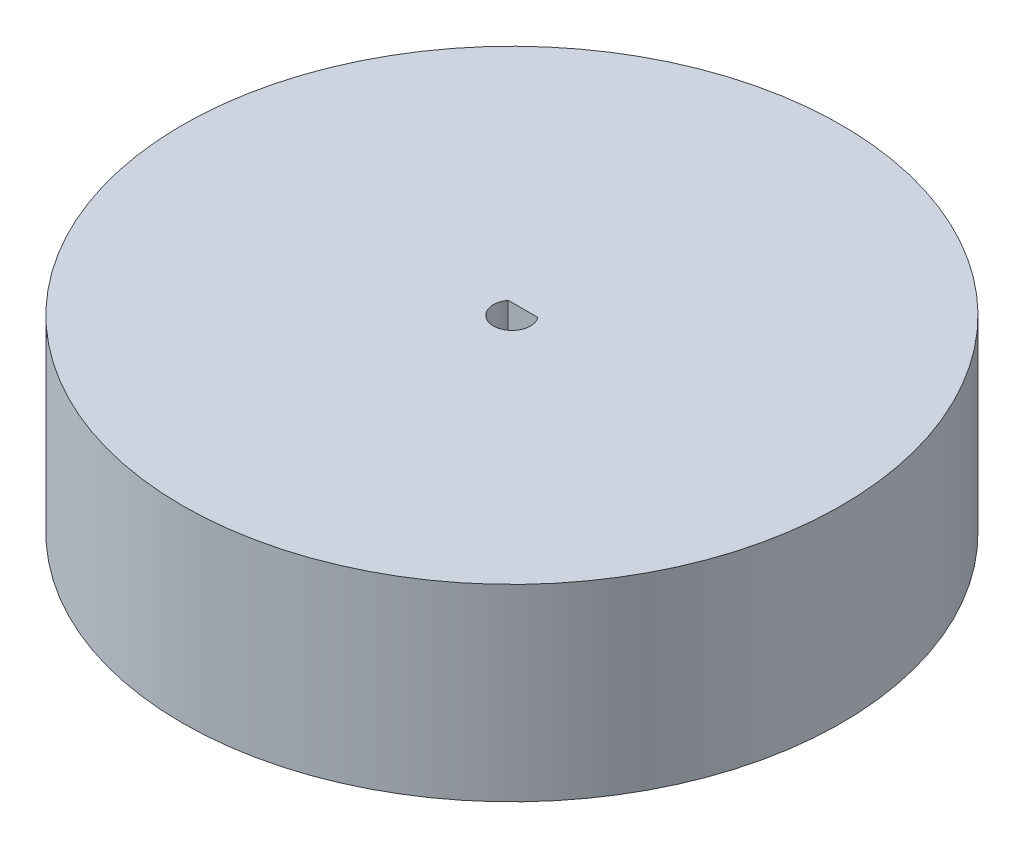
ISO-10303-21;
HEADER;
FILE_DESCRIPTION(('STEP AP214'),'2;1');
FILE_NAME('part.step','',(''),(''),'','','');
FILE_SCHEMA(('AUTOMOTIVE_DESIGN { 1 0 10303 214 1 1 1 1 }'));
ENDSEC;
DATA;
#1=APPLICATION_CONTEXT('core data for automotive mechanical design processes');
#2=APPLICATION_PROTOCOL_DEFINITION('international standard','automotive_design',2000,#1);
#3=PRODUCT_CONTEXT('',#1,'mechanical');
#4=PRODUCT('Part','Part','',(#3));
#5=PRODUCT_RELATED_PRODUCT_CATEGORY('part','',(#4));
#6=PRODUCT_DEFINITION_FORMATION('','',#4);
#7=PRODUCT_DEFINITION_CONTEXT('part definition',#1,'design');
#8=PRODUCT_DEFINITION('design','',#6,#7);
#9=PRODUCT_DEFINITION_SHAPE('','',#8);
#10=(LENGTH_UNIT() NAMED_UNIT(*) SI_UNIT(.MILLI.,.METRE.));
#11=(NAMED_UNIT(*) PLANE_ANGLE_UNIT() SI_UNIT($,.RADIAN.));
#12=(NAMED_UNIT(*) SI_UNIT($,.STERADIAN.) SOLID_ANGLE_UNIT());
#13=UNCERTAINTY_MEASURE_WITH_UNIT(LENGTH_MEASURE(1.E-05),#10,'distance_accuracy_value','');
#14=(GEOMETRIC_REPRESENTATION_CONTEXT(3) GLOBAL_UNCERTAINTY_ASSIGNED_CONTEXT((#13)) GLOBAL_UNIT_ASSIGNED_CONTEXT((#10,
#11,#12)) REPRESENTATION_CONTEXT('',''));
#15=CARTESIAN_POINT('',(0.,0.,0.));
#16=DIRECTION('',(0.,0.,1.));
#17=DIRECTION('',(1.,0.,0.));
#18=AXIS2_PLACEMENT_3D('',#15,#16,#17);
#19=CARTESIAN_POINT('',(0.,12.7,0.));
#20=DIRECTION('',(0.,-1.,0.));
#21=DIRECTION('',(0.,0.,-1.));
#22=AXIS2_PLACEMENT_3D('',#19,#20,#21);
#23=CYLINDRICAL_SURFACE('',#22,1.25);
#24=CARTESIAN_POINT('',(0.,0.,0.));
#25=DIRECTION('',(0.,1.,0.));
#26=DIRECTION('',(0.,0.,1.));
#27=AXIS2_PLACEMENT_3D('',#24,#25,#26);
#28=CIRCLE('',#27,1.25);
#29=CARTESIAN_POINT('',(-1.,0.,-0.75));
#30=VERTEX_POINT('',#29);
#31=CARTESIAN_POINT('',(1.,0.,-0.75));
#32=VERTEX_POINT('',#31);
#33=EDGE_CURVE('E67',#30,#32,#28,.T.);
#34=ORIENTED_EDGE('',*,*,#33,.F.);
#35=DIRECTION('',(0.,-1.,0.));
#36=VECTOR('',#35,1.);
#37=CARTESIAN_POINT('',(-1.,12.7,-0.75));
#38=LINE('',#37,#36);
#39=CARTESIAN_POINT('',(-1.,12.7,-0.75));
#40=VERTEX_POINT('',#39);
#41=EDGE_CURVE('E11',#40,#30,#38,.T.);
#42=ORIENTED_EDGE('',*,*,#41,.F.);
#43=CARTESIAN_POINT('',(0.,12.7,0.));
#44=DIRECTION('',(0.,1.,0.));
#45=DIRECTION('',(0.,0.,1.));
#46=AXIS2_PLACEMENT_3D('',#43,#44,#45);
#47=CIRCLE('',#46,1.25);
#48=CARTESIAN_POINT('',(1.,12.7,-0.75));
#49=VERTEX_POINT('',#48);
#50=EDGE_CURVE('E68',#40,#49,#47,.T.);
#51=ORIENTED_EDGE('',*,*,#50,.T.);
#52=DIRECTION('',(0.,-1.,0.));
#53=VECTOR('',#52,1.);
#54=CARTESIAN_POINT('',(1.,12.7,-0.75));
#55=LINE('',#54,#53);
#56=EDGE_CURVE('E47',#49,#32,#55,.T.);
#57=ORIENTED_EDGE('',*,*,#56,.T.);
#58=EDGE_LOOP('',(#34,#42,#51,#57));
#59=FACE_BOUND('',#58,.T.);
#60=ADVANCED_FACE('F39',(#59),#23,.F.);
#61=CARTESIAN_POINT('',(0.,12.7,-0.75));
#62=DIRECTION('',(0.,0.,-1.));
#63=DIRECTION('',(-1.,0.,0.));
#64=AXIS2_PLACEMENT_3D('',#61,#62,#63);
#65=PLANE('',#64);
#66=DIRECTION('',(1.,0.,0.));
#67=VECTOR('',#66,1.);
#68=CARTESIAN_POINT('',(0.,0.,-0.75));
#69=LINE('',#68,#67);
#70=EDGE_CURVE('E70',#30,#32,#69,.T.);
#71=ORIENTED_EDGE('',*,*,#70,.T.);
#72=ORIENTED_EDGE('',*,*,#56,.F.);
#73=DIRECTION('',(1.,0.,0.));
#74=VECTOR('',#73,1.);
#75=CARTESIAN_POINT('',(0.,12.7,-0.75));
#76=LINE('',#75,#74);
#77=EDGE_CURVE('E54',#40,#49,#76,.T.);
#78=ORIENTED_EDGE('',*,*,#77,.F.);
#79=ORIENTED_EDGE('',*,*,#41,.T.);
#80=EDGE_LOOP('',(#71,#72,#78,#79));
#81=FACE_BOUND('',#80,.T.);
#82=ADVANCED_FACE('F71',(#81),#65,.F.);
#83=CARTESIAN_POINT('',(0.,12.7,0.));
#84=DIRECTION('',(0.,-1.,0.));
#85=DIRECTION('',(0.,0.,-1.));
#86=AXIS2_PLACEMENT_3D('',#83,#84,#85);
#87=CYLINDRICAL_SURFACE('',#86,22.225);
#88=CARTESIAN_POINT('',(0.,12.7,0.));
#89=DIRECTION('',(0.,1.,0.));
#90=DIRECTION('',(0.,0.,1.));
#91=AXIS2_PLACEMENT_3D('',#88,#89,#90);
#92=CIRCLE('',#91,22.225);
#93=CARTESIAN_POINT('',(0.,12.7,22.225));
#94=VERTEX_POINT('',#93);
#95=EDGE_CURVE('E69',#94,#94,#92,.T.);
#96=ORIENTED_EDGE('',*,*,#95,.F.);
#97=EDGE_LOOP('',(#96));
#98=FACE_BOUND('',#97,.T.);
#99=CARTESIAN_POINT('',(0.,0.,0.));
#100=DIRECTION('',(0.,1.,0.));
#101=DIRECTION('',(0.,0.,1.));
#102=AXIS2_PLACEMENT_3D('',#99,#100,#101);
#103=CIRCLE('',#102,22.225);
#104=CARTESIAN_POINT('',(0.,0.,22.225));
#105=VERTEX_POINT('',#104);
#106=EDGE_CURVE('E73',#105,#105,#103,.T.);
#107=ORIENTED_EDGE('',*,*,#106,.T.);
#108=EDGE_LOOP('',(#107));
#109=FACE_BOUND('',#108,.T.);
#110=ADVANCED_FACE('F90',(#98,#109),#87,.T.);
#111=CARTESIAN_POINT('',(0.,12.7,0.));
#112=DIRECTION('',(0.,1.,0.));
#113=DIRECTION('',(0.,0.,1.));
#114=AXIS2_PLACEMENT_3D('',#111,#112,#113);
#115=PLANE('',#114);
#116=ORIENTED_EDGE('',*,*,#50,.F.);
#117=ORIENTED_EDGE('',*,*,#77,.T.);
#118=EDGE_LOOP('',(#116,#117));
#119=FACE_BOUND('',#118,.T.);
#120=ORIENTED_EDGE('',*,*,#95,.T.);
#121=EDGE_LOOP('',(#120));
#122=FACE_BOUND('',#121,.T.);
#123=ADVANCED_FACE('F88',(#119,#122),#115,.T.);
#124=CARTESIAN_POINT('',(0.,0.,0.));
#125=DIRECTION('',(0.,1.,0.));
#126=DIRECTION('',(0.,0.,1.));
#127=AXIS2_PLACEMENT_3D('',#124,#125,#126);
#128=PLANE('',#127);
#129=ORIENTED_EDGE('',*,*,#33,.T.);
#130=ORIENTED_EDGE('',*,*,#70,.F.);
#131=EDGE_LOOP('',(#129,#130));
#132=FACE_BOUND('',#131,.T.);
#133=ORIENTED_EDGE('',*,*,#106,.F.);
#134=EDGE_LOOP('',(#133));
#135=FACE_BOUND('',#134,.T.);
#136=ADVANCED_FACE('F75',(#132,#135),#128,.F.);
#137=CLOSED_SHELL('',(#60,#82,#110,#123,#136));
#138=MANIFOLD_SOLID_BREP('B2',#137);
#139=ADVANCED_BREP_SHAPE_REPRESENTATION('',(#18,#138),#14);
#140=SHAPE_DEFINITION_REPRESENTATION(#9,#139);
ENDSEC;
END-ISO-10303-21;
